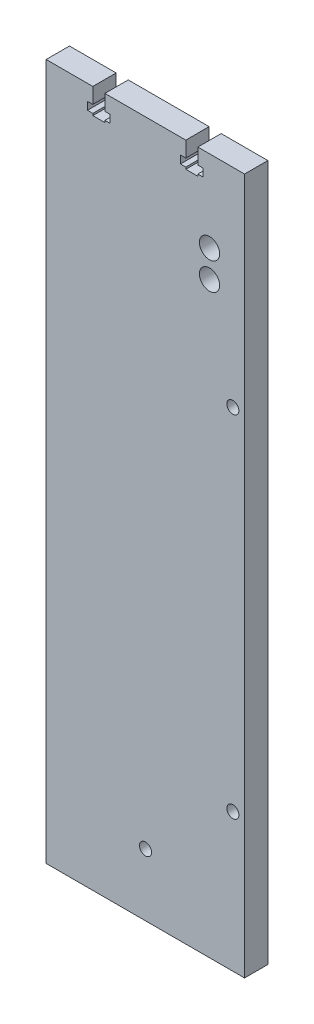
ISO-10303-21;
HEADER;
FILE_DESCRIPTION(('STEP AP214'),'2;1');
FILE_NAME('part.step','',(''),(''),'','','');
FILE_SCHEMA(('AUTOMOTIVE_DESIGN { 1 0 10303 214 1 1 1 1 }'));
ENDSEC;
DATA;
#1=APPLICATION_CONTEXT('core data for automotive mechanical design processes');
#2=APPLICATION_PROTOCOL_DEFINITION('international standard','automotive_design',2000,#1);
#3=PRODUCT_CONTEXT('',#1,'mechanical');
#4=PRODUCT('Part','Part','',(#3));
#5=PRODUCT_RELATED_PRODUCT_CATEGORY('part','',(#4));
#6=PRODUCT_DEFINITION_FORMATION('','',#4);
#7=PRODUCT_DEFINITION_CONTEXT('part definition',#1,'design');
#8=PRODUCT_DEFINITION('design','',#6,#7);
#9=PRODUCT_DEFINITION_SHAPE('','',#8);
#10=(LENGTH_UNIT() NAMED_UNIT(*) SI_UNIT(.MILLI.,.METRE.));
#11=(NAMED_UNIT(*) PLANE_ANGLE_UNIT() SI_UNIT($,.RADIAN.));
#12=(NAMED_UNIT(*) SI_UNIT($,.STERADIAN.) SOLID_ANGLE_UNIT());
#13=UNCERTAINTY_MEASURE_WITH_UNIT(LENGTH_MEASURE(1.E-05),#10,'distance_accuracy_value','');
#14=(GEOMETRIC_REPRESENTATION_CONTEXT(3) GLOBAL_UNCERTAINTY_ASSIGNED_CONTEXT((#13)) GLOBAL_UNIT_ASSIGNED_CONTEXT((#10,
#11,#12)) REPRESENTATION_CONTEXT('',''));
#15=CARTESIAN_POINT('',(0.,0.,0.));
#16=DIRECTION('',(0.,0.,1.));
#17=DIRECTION('',(1.,0.,0.));
#18=AXIS2_PLACEMENT_3D('',#15,#16,#17);
#19=CARTESIAN_POINT('',(23.5056995135494,-21.,-6.));
#20=DIRECTION('',(0.,1.,0.));
#21=DIRECTION('',(0.,0.,1.));
#22=AXIS2_PLACEMENT_3D('',#19,#20,#21);
#23=PLANE('',#22);
#24=DIRECTION('',(0.,0.,-1.));
#25=VECTOR('',#24,1.);
#26=CARTESIAN_POINT('',(35.5056995135494,-21.,0.));
#27=LINE('',#26,#25);
#28=CARTESIAN_POINT('',(35.5056995135494,-21.,0.));
#29=VERTEX_POINT('',#28);
#30=CARTESIAN_POINT('',(35.5056995135494,-21.,-6.));
#31=VERTEX_POINT('',#30);
#32=EDGE_CURVE('E221',#29,#31,#27,.T.);
#33=ORIENTED_EDGE('',*,*,#32,.T.);
#34=DIRECTION('',(-1.,0.,0.));
#35=VECTOR('',#34,1.);
#36=CARTESIAN_POINT('',(23.5056995135494,-21.,-6.));
#37=LINE('',#36,#35);
#38=CARTESIAN_POINT('',(23.5056995135494,-21.,-6.));
#39=VERTEX_POINT('',#38);
#40=EDGE_CURVE('E271',#31,#39,#37,.T.);
#41=ORIENTED_EDGE('',*,*,#40,.T.);
#42=DIRECTION('',(0.,0.,1.));
#43=VECTOR('',#42,1.);
#44=CARTESIAN_POINT('',(23.5056995135494,-21.,-6.));
#45=LINE('',#44,#43);
#46=CARTESIAN_POINT('',(23.5056995135494,-21.,0.));
#47=VERTEX_POINT('',#46);
#48=EDGE_CURVE('E11',#39,#47,#45,.T.);
#49=ORIENTED_EDGE('',*,*,#48,.T.);
#50=DIRECTION('',(-1.,0.,0.));
#51=VECTOR('',#50,1.);
#52=CARTESIAN_POINT('',(23.5056995135494,-21.,0.));
#53=LINE('',#52,#51);
#54=EDGE_CURVE('E237',#29,#47,#53,.T.);
#55=ORIENTED_EDGE('',*,*,#54,.F.);
#56=EDGE_LOOP('',(#33,#41,#49,#55));
#57=FACE_BOUND('',#56,.T.);
#58=ADVANCED_FACE('F34',(#57),#23,.T.);
#59=DIRECTION('',(0.,0.,-1.));
#60=VECTOR('',#59,1.);
#61=CARTESIAN_POINT('',(38.6056995135494,-21.,0.));
#62=LINE('',#61,#60);
#63=CARTESIAN_POINT('',(38.6056995135494,-21.,0.));
#64=VERTEX_POINT('',#63);
#65=CARTESIAN_POINT('',(38.6056995135494,-21.,-6.));
#66=VERTEX_POINT('',#65);
#67=EDGE_CURVE('E231',#64,#66,#62,.T.);
#68=ORIENTED_EDGE('',*,*,#67,.F.);
#69=CARTESIAN_POINT('',(59.4056995135494,-21.,0.));
#70=VERTEX_POINT('',#69);
#71=EDGE_CURVE('E245',#70,#64,#53,.T.);
#72=ORIENTED_EDGE('',*,*,#71,.F.);
#73=DIRECTION('',(0.,0.,-1.));
#74=VECTOR('',#73,1.);
#75=CARTESIAN_POINT('',(59.4056995135494,-21.,0.));
#76=LINE('',#75,#74);
#77=CARTESIAN_POINT('',(59.4056995135494,-21.,-6.));
#78=VERTEX_POINT('',#77);
#79=EDGE_CURVE('E299',#70,#78,#76,.T.);
#80=ORIENTED_EDGE('',*,*,#79,.T.);
#81=EDGE_CURVE('E275',#78,#66,#37,.T.);
#82=ORIENTED_EDGE('',*,*,#81,.T.);
#83=EDGE_LOOP('',(#68,#72,#80,#82));
#84=FACE_BOUND('',#83,.T.);
#85=ADVANCED_FACE('F336',(#84),#23,.T.);
#86=CARTESIAN_POINT('',(23.5056995135494,-200.,-6.));
#87=DIRECTION('',(-1.,0.,0.));
#88=DIRECTION('',(0.,-1.,0.));
#89=AXIS2_PLACEMENT_3D('',#86,#87,#88);
#90=PLANE('',#89);
#91=DIRECTION('',(0.,-1.,0.));
#92=VECTOR('',#91,1.);
#93=CARTESIAN_POINT('',(23.5056995135494,-200.,0.));
#94=LINE('',#93,#92);
#95=CARTESIAN_POINT('',(23.5056995135494,-200.,0.));
#96=VERTEX_POINT('',#95);
#97=EDGE_CURVE('E276',#47,#96,#94,.T.);
#98=ORIENTED_EDGE('',*,*,#97,.F.);
#99=ORIENTED_EDGE('',*,*,#48,.F.);
#100=DIRECTION('',(0.,-1.,0.));
#101=VECTOR('',#100,1.);
#102=CARTESIAN_POINT('',(23.5056995135494,-200.,-6.));
#103=LINE('',#102,#101);
#104=CARTESIAN_POINT('',(23.5056995135494,-200.,-6.));
#105=VERTEX_POINT('',#104);
#106=EDGE_CURVE('E254',#39,#105,#103,.T.);
#107=ORIENTED_EDGE('',*,*,#106,.T.);
#108=DIRECTION('',(0.,0.,1.));
#109=VECTOR('',#108,1.);
#110=CARTESIAN_POINT('',(23.5056995135494,-200.,-6.));
#111=LINE('',#110,#109);
#112=EDGE_CURVE('E38',#105,#96,#111,.T.);
#113=ORIENTED_EDGE('',*,*,#112,.T.);
#114=EDGE_LOOP('',(#98,#99,#107,#113));
#115=FACE_BOUND('',#114,.T.);
#116=ADVANCED_FACE('F36',(#115),#90,.T.);
#117=DIRECTION('',(0.,0.,-1.));
#118=VECTOR('',#117,1.);
#119=CARTESIAN_POINT('',(62.5056995135494,-21.,0.));
#120=LINE('',#119,#118);
#121=CARTESIAN_POINT('',(62.5056995135494,-21.,0.));
#122=VERTEX_POINT('',#121);
#123=CARTESIAN_POINT('',(62.5056995135494,-21.,-6.));
#124=VERTEX_POINT('',#123);
#125=EDGE_CURVE('E294',#122,#124,#120,.T.);
#126=ORIENTED_EDGE('',*,*,#125,.F.);
#127=CARTESIAN_POINT('',(74.5056995135493,-21.,0.));
#128=VERTEX_POINT('',#127);
#129=EDGE_CURVE('E248',#128,#122,#53,.T.);
#130=ORIENTED_EDGE('',*,*,#129,.F.);
#131=DIRECTION('',(0.,0.,1.));
#132=VECTOR('',#131,1.);
#133=CARTESIAN_POINT('',(74.5056995135493,-21.,-6.));
#134=LINE('',#133,#132);
#135=CARTESIAN_POINT('',(74.5056995135493,-21.,-6.));
#136=VERTEX_POINT('',#135);
#137=EDGE_CURVE('E43',#136,#128,#134,.T.);
#138=ORIENTED_EDGE('',*,*,#137,.F.);
#139=EDGE_CURVE('E272',#136,#124,#37,.T.);
#140=ORIENTED_EDGE('',*,*,#139,.T.);
#141=EDGE_LOOP('',(#126,#130,#138,#140));
#142=FACE_BOUND('',#141,.T.);
#143=ADVANCED_FACE('F293',(#142),#23,.T.);
#144=CARTESIAN_POINT('',(74.5056995135494,-200.,-6.));
#145=DIRECTION('',(1.,0.,0.));
#146=DIRECTION('',(0.,1.,0.));
#147=AXIS2_PLACEMENT_3D('',#144,#145,#146);
#148=PLANE('',#147);
#149=DIRECTION('',(0.,1.,0.));
#150=VECTOR('',#149,1.);
#151=CARTESIAN_POINT('',(74.5056995135494,-200.,0.));
#152=LINE('',#151,#150);
#153=CARTESIAN_POINT('',(74.5056995135494,-200.,0.));
#154=VERTEX_POINT('',#153);
#155=EDGE_CURVE('E246',#154,#128,#152,.T.);
#156=ORIENTED_EDGE('',*,*,#155,.F.);
#157=DIRECTION('',(0.,0.,1.));
#158=VECTOR('',#157,1.);
#159=CARTESIAN_POINT('',(74.5056995135494,-200.,-6.));
#160=LINE('',#159,#158);
#161=CARTESIAN_POINT('',(74.5056995135494,-200.,-6.));
#162=VERTEX_POINT('',#161);
#163=EDGE_CURVE('E285',#162,#154,#160,.T.);
#164=ORIENTED_EDGE('',*,*,#163,.F.);
#165=DIRECTION('',(0.,1.,0.));
#166=VECTOR('',#165,1.);
#167=CARTESIAN_POINT('',(74.5056995135494,-200.,-6.));
#168=LINE('',#167,#166);
#169=EDGE_CURVE('E263',#162,#136,#168,.T.);
#170=ORIENTED_EDGE('',*,*,#169,.T.);
#171=ORIENTED_EDGE('',*,*,#137,.T.);
#172=EDGE_LOOP('',(#156,#164,#170,#171));
#173=FACE_BOUND('',#172,.T.);
#174=ADVANCED_FACE('F288',(#173),#148,.T.);
#175=CARTESIAN_POINT('',(23.5056995135494,-200.,-6.));
#176=DIRECTION('',(0.,-1.,0.));
#177=DIRECTION('',(0.,0.,-1.));
#178=AXIS2_PLACEMENT_3D('',#175,#176,#177);
#179=PLANE('',#178);
#180=DIRECTION('',(1.,0.,0.));
#181=VECTOR('',#180,1.);
#182=CARTESIAN_POINT('',(23.5056995135494,-200.,0.));
#183=LINE('',#182,#181);
#184=EDGE_CURVE('E251',#96,#154,#183,.T.);
#185=ORIENTED_EDGE('',*,*,#184,.F.);
#186=ORIENTED_EDGE('',*,*,#112,.F.);
#187=DIRECTION('',(1.,0.,0.));
#188=VECTOR('',#187,1.);
#189=CARTESIAN_POINT('',(23.5056995135494,-200.,-6.));
#190=LINE('',#189,#188);
#191=EDGE_CURVE('E258',#105,#162,#190,.T.);
#192=ORIENTED_EDGE('',*,*,#191,.T.);
#193=ORIENTED_EDGE('',*,*,#163,.T.);
#194=EDGE_LOOP('',(#185,#186,#192,#193));
#195=FACE_BOUND('',#194,.T.);
#196=ADVANCED_FACE('F283',(#195),#179,.T.);
#197=CARTESIAN_POINT('',(0.,0.,-6.));
#198=DIRECTION('',(0.,0.,-1.));
#199=DIRECTION('',(-1.,0.,0.));
#200=AXIS2_PLACEMENT_3D('',#197,#198,#199);
#201=PLANE('',#200);
#202=CARTESIAN_POINT('',(49.0556995135438,-184.,-6.));
#203=DIRECTION('',(0.,0.,-1.));
#204=DIRECTION('',(-1.,0.,0.));
#205=AXIS2_PLACEMENT_3D('',#202,#203,#204);
#206=CIRCLE('',#205,1.55);
#207=CARTESIAN_POINT('',(47.5056995135438,-184.,-6.));
#208=VERTEX_POINT('',#207);
#209=EDGE_CURVE('E539',#208,#208,#206,.T.);
#210=ORIENTED_EDGE('',*,*,#209,.F.);
#211=EDGE_LOOP('',(#210));
#212=FACE_BOUND('',#211,.T.);
#213=CARTESIAN_POINT('',(65.5056995135494,-49.,-6.));
#214=DIRECTION('',(0.,0.,-1.));
#215=DIRECTION('',(-1.,0.,0.));
#216=AXIS2_PLACEMENT_3D('',#213,#214,#215);
#217=CIRCLE('',#216,2.6);
#218=CARTESIAN_POINT('',(62.9056995135494,-49.,-6.));
#219=VERTEX_POINT('',#218);
#220=EDGE_CURVE('E533',#219,#219,#217,.T.);
#221=ORIENTED_EDGE('',*,*,#220,.F.);
#222=EDGE_LOOP('',(#221));
#223=FACE_BOUND('',#222,.T.);
#224=CARTESIAN_POINT('',(65.5056995135494,-42.,-6.));
#225=DIRECTION('',(0.,0.,-1.));
#226=DIRECTION('',(-1.,0.,0.));
#227=AXIS2_PLACEMENT_3D('',#224,#225,#226);
#228=CIRCLE('',#227,2.6);
#229=CARTESIAN_POINT('',(62.9056995135494,-42.,-6.));
#230=VERTEX_POINT('',#229);
#231=EDGE_CURVE('E527',#230,#230,#228,.T.);
#232=ORIENTED_EDGE('',*,*,#231,.F.);
#233=EDGE_LOOP('',(#232));
#234=FACE_BOUND('',#233,.T.);
#235=DIRECTION('',(0.,1.,0.));
#236=VECTOR('',#235,1.);
#237=CARTESIAN_POINT('',(35.5056995135494,-21.,-6.));
#238=LINE('',#237,#236);
#239=CARTESIAN_POINT('',(35.5056995135494,-25.,-6.));
#240=VERTEX_POINT('',#239);
#241=EDGE_CURVE('E227',#240,#31,#238,.T.);
#242=ORIENTED_EDGE('',*,*,#241,.F.);
#243=DIRECTION('',(1.,0.,0.));
#244=VECTOR('',#243,1.);
#245=CARTESIAN_POINT('',(34.1306995135494,-25.,-6.));
#246=LINE('',#245,#244);
#247=CARTESIAN_POINT('',(34.1306995135494,-25.,-6.));
#248=VERTEX_POINT('',#247);
#249=EDGE_CURVE('E241',#248,#240,#246,.T.);
#250=ORIENTED_EDGE('',*,*,#249,.F.);
#251=DIRECTION('',(0.,1.,0.));
#252=VECTOR('',#251,1.);
#253=CARTESIAN_POINT('',(34.1306995135494,-27.,-6.));
#254=LINE('',#253,#252);
#255=CARTESIAN_POINT('',(34.1306995135494,-27.,-6.));
#256=VERTEX_POINT('',#255);
#257=EDGE_CURVE('E474',#256,#248,#254,.T.);
#258=ORIENTED_EDGE('',*,*,#257,.F.);
#259=DIRECTION('',(-1.,0.,0.));
#260=VECTOR('',#259,1.);
#261=CARTESIAN_POINT('',(34.1306995135494,-27.,-6.));
#262=LINE('',#261,#260);
#263=CARTESIAN_POINT('',(35.5056995135494,-27.,-6.));
#264=VERTEX_POINT('',#263);
#265=EDGE_CURVE('E477',#264,#256,#262,.T.);
#266=ORIENTED_EDGE('',*,*,#265,.F.);
#267=DIRECTION('',(0.,1.,0.));
#268=VECTOR('',#267,1.);
#269=CARTESIAN_POINT('',(35.5056995135494,-27.,-6.));
#270=LINE('',#269,#268);
#271=CARTESIAN_POINT('',(35.5056995135494,-27.5,-6.));
#272=VERTEX_POINT('',#271);
#273=EDGE_CURVE('E480',#272,#264,#270,.T.);
#274=ORIENTED_EDGE('',*,*,#273,.F.);
#275=DIRECTION('',(-1.,0.,0.));
#276=VECTOR('',#275,1.);
#277=CARTESIAN_POINT('',(35.5056995135494,-27.5,-6.));
#278=LINE('',#277,#276);
#279=CARTESIAN_POINT('',(38.6056995135494,-27.5,-6.));
#280=VERTEX_POINT('',#279);
#281=EDGE_CURVE('E483',#280,#272,#278,.T.);
#282=ORIENTED_EDGE('',*,*,#281,.F.);
#283=DIRECTION('',(0.,-1.,0.));
#284=VECTOR('',#283,1.);
#285=CARTESIAN_POINT('',(38.6056995135494,-27.,-6.));
#286=LINE('',#285,#284);
#287=CARTESIAN_POINT('',(38.6056995135494,-27.,-6.));
#288=VERTEX_POINT('',#287);
#289=EDGE_CURVE('E486',#288,#280,#286,.T.);
#290=ORIENTED_EDGE('',*,*,#289,.F.);
#291=DIRECTION('',(-1.,0.,0.));
#292=VECTOR('',#291,1.);
#293=CARTESIAN_POINT('',(38.6056995135494,-27.,-6.));
#294=LINE('',#293,#292);
#295=CARTESIAN_POINT('',(39.9806995135494,-27.,-6.));
#296=VERTEX_POINT('',#295);
#297=EDGE_CURVE('E489',#296,#288,#294,.T.);
#298=ORIENTED_EDGE('',*,*,#297,.F.);
#299=DIRECTION('',(0.,-1.,0.));
#300=VECTOR('',#299,1.);
#301=CARTESIAN_POINT('',(39.9806995135494,-27.,-6.));
#302=LINE('',#301,#300);
#303=CARTESIAN_POINT('',(39.9806995135494,-25.,-6.));
#304=VERTEX_POINT('',#303);
#305=EDGE_CURVE('E492',#304,#296,#302,.T.);
#306=ORIENTED_EDGE('',*,*,#305,.F.);
#307=DIRECTION('',(1.,0.,0.));
#308=VECTOR('',#307,1.);
#309=CARTESIAN_POINT('',(38.6056995135494,-25.,-6.));
#310=LINE('',#309,#308);
#311=CARTESIAN_POINT('',(38.6056995135494,-25.,-6.));
#312=VERTEX_POINT('',#311);
#313=EDGE_CURVE('E495',#312,#304,#310,.T.);
#314=ORIENTED_EDGE('',*,*,#313,.F.);
#315=DIRECTION('',(0.,-1.,0.));
#316=VECTOR('',#315,1.);
#317=CARTESIAN_POINT('',(38.6056995135494,-21.,-6.));
#318=LINE('',#317,#316);
#319=EDGE_CURVE('E498',#66,#312,#318,.T.);
#320=ORIENTED_EDGE('',*,*,#319,.F.);
#321=ORIENTED_EDGE('',*,*,#81,.F.);
#322=DIRECTION('',(0.,1.,0.));
#323=VECTOR('',#322,1.);
#324=CARTESIAN_POINT('',(59.4056995135494,-21.,-6.));
#325=LINE('',#324,#323);
#326=CARTESIAN_POINT('',(59.4056995135494,-25.,-6.));
#327=VERTEX_POINT('',#326);
#328=EDGE_CURVE('E357',#327,#78,#325,.T.);
#329=ORIENTED_EDGE('',*,*,#328,.F.);
#330=DIRECTION('',(1.,0.,0.));
#331=VECTOR('',#330,1.);
#332=CARTESIAN_POINT('',(58.0306995135494,-25.,-6.));
#333=LINE('',#332,#331);
#334=CARTESIAN_POINT('',(58.0306995135494,-25.,-6.));
#335=VERTEX_POINT('',#334);
#336=EDGE_CURVE('E385',#335,#327,#333,.T.);
#337=ORIENTED_EDGE('',*,*,#336,.F.);
#338=DIRECTION('',(0.,1.,0.));
#339=VECTOR('',#338,1.);
#340=CARTESIAN_POINT('',(58.0306995135494,-27.,-6.));
#341=LINE('',#340,#339);
#342=CARTESIAN_POINT('',(58.0306995135494,-27.,-6.));
#343=VERTEX_POINT('',#342);
#344=EDGE_CURVE('E382',#343,#335,#341,.T.);
#345=ORIENTED_EDGE('',*,*,#344,.F.);
#346=DIRECTION('',(-1.,0.,0.));
#347=VECTOR('',#346,1.);
#348=CARTESIAN_POINT('',(58.0306995135494,-27.,-6.));
#349=LINE('',#348,#347);
#350=CARTESIAN_POINT('',(59.4056995135494,-27.,-6.));
#351=VERTEX_POINT('',#350);
#352=EDGE_CURVE('E379',#351,#343,#349,.T.);
#353=ORIENTED_EDGE('',*,*,#352,.F.);
#354=DIRECTION('',(0.,1.,0.));
#355=VECTOR('',#354,1.);
#356=CARTESIAN_POINT('',(59.4056995135494,-27.,-6.));
#357=LINE('',#356,#355);
#358=CARTESIAN_POINT('',(59.4056995135494,-27.5,-6.));
#359=VERTEX_POINT('',#358);
#360=EDGE_CURVE('E376',#359,#351,#357,.T.);
#361=ORIENTED_EDGE('',*,*,#360,.F.);
#362=DIRECTION('',(-1.,0.,0.));
#363=VECTOR('',#362,1.);
#364=CARTESIAN_POINT('',(59.4056995135494,-27.5,-6.));
#365=LINE('',#364,#363);
#366=CARTESIAN_POINT('',(62.5056995135494,-27.5,-6.));
#367=VERTEX_POINT('',#366);
#368=EDGE_CURVE('E373',#367,#359,#365,.T.);
#369=ORIENTED_EDGE('',*,*,#368,.F.);
#370=DIRECTION('',(0.,-1.,0.));
#371=VECTOR('',#370,1.);
#372=CARTESIAN_POINT('',(62.5056995135494,-27.,-6.));
#373=LINE('',#372,#371);
#374=CARTESIAN_POINT('',(62.5056995135494,-27.,-6.));
#375=VERTEX_POINT('',#374);
#376=EDGE_CURVE('E370',#375,#367,#373,.T.);
#377=ORIENTED_EDGE('',*,*,#376,.F.);
#378=DIRECTION('',(-1.,0.,0.));
#379=VECTOR('',#378,1.);
#380=CARTESIAN_POINT('',(62.5056995135494,-27.,-6.));
#381=LINE('',#380,#379);
#382=CARTESIAN_POINT('',(63.8806995135494,-27.,-6.));
#383=VERTEX_POINT('',#382);
#384=EDGE_CURVE('E367',#383,#375,#381,.T.);
#385=ORIENTED_EDGE('',*,*,#384,.F.);
#386=DIRECTION('',(0.,-1.,0.));
#387=VECTOR('',#386,1.);
#388=CARTESIAN_POINT('',(63.8806995135494,-27.,-6.));
#389=LINE('',#388,#387);
#390=CARTESIAN_POINT('',(63.8806995135494,-25.,-6.));
#391=VERTEX_POINT('',#390);
#392=EDGE_CURVE('E359',#391,#383,#389,.T.);
#393=ORIENTED_EDGE('',*,*,#392,.F.);
#394=DIRECTION('',(1.,0.,0.));
#395=VECTOR('',#394,1.);
#396=CARTESIAN_POINT('',(62.5056995135494,-25.,-6.));
#397=LINE('',#396,#395);
#398=CARTESIAN_POINT('',(62.5056995135494,-25.,-6.));
#399=VERTEX_POINT('',#398);
#400=EDGE_CURVE('E356',#399,#391,#397,.T.);
#401=ORIENTED_EDGE('',*,*,#400,.F.);
#402=DIRECTION('',(0.,-1.,0.));
#403=VECTOR('',#402,1.);
#404=CARTESIAN_POINT('',(62.5056995135494,-21.,-6.));
#405=LINE('',#404,#403);
#406=EDGE_CURVE('E353',#124,#399,#405,.T.);
#407=ORIENTED_EDGE('',*,*,#406,.F.);
#408=ORIENTED_EDGE('',*,*,#139,.F.);
#409=ORIENTED_EDGE('',*,*,#169,.F.);
#410=ORIENTED_EDGE('',*,*,#191,.F.);
#411=ORIENTED_EDGE('',*,*,#106,.F.);
#412=ORIENTED_EDGE('',*,*,#40,.F.);
#413=EDGE_LOOP('',(#242,#250,#258,#266,#274,#282,#290,#298,#306,#314,#320,#321,#329,#337,#345,
#353,#361,#369,#377,#385,#393,#401,#407,#408,#409,#410,#411,#412));
#414=FACE_BOUND('',#413,.T.);
#415=CARTESIAN_POINT('',(71.5056995135493,-74.45,-6.));
#416=DIRECTION('',(0.,0.,-1.));
#417=DIRECTION('',(-1.,0.,0.));
#418=AXIS2_PLACEMENT_3D('',#415,#416,#417);
#419=CIRCLE('',#418,1.54999999999994);
#420=CARTESIAN_POINT('',(69.9556995135493,-74.45,-6.));
#421=VERTEX_POINT('',#420);
#422=EDGE_CURVE('E311',#421,#421,#419,.T.);
#423=ORIENTED_EDGE('',*,*,#422,.F.);
#424=EDGE_LOOP('',(#423));
#425=FACE_BOUND('',#424,.T.);
#426=CARTESIAN_POINT('',(71.5056995135493,-164.45,-6.));
#427=DIRECTION('',(0.,0.,-1.));
#428=DIRECTION('',(-1.,0.,0.));
#429=AXIS2_PLACEMENT_3D('',#426,#427,#428);
#430=CIRCLE('',#429,1.54999999999991);
#431=CARTESIAN_POINT('',(69.9556995135494,-164.45,-6.));
#432=VERTEX_POINT('',#431);
#433=EDGE_CURVE('E266',#432,#432,#430,.T.);
#434=ORIENTED_EDGE('',*,*,#433,.F.);
#435=EDGE_LOOP('',(#434));
#436=FACE_BOUND('',#435,.T.);
#437=ADVANCED_FACE('F322',(#212,#223,#234,#414,#425,#436),#201,.T.);
#438=CARTESIAN_POINT('',(0.,0.,0.));
#439=DIRECTION('',(0.,0.,-1.));
#440=DIRECTION('',(-1.,0.,0.));
#441=AXIS2_PLACEMENT_3D('',#438,#439,#440);
#442=PLANE('',#441);
#443=CARTESIAN_POINT('',(49.0556995135438,-184.,0.));
#444=DIRECTION('',(0.,0.,-1.));
#445=DIRECTION('',(-1.,0.,0.));
#446=AXIS2_PLACEMENT_3D('',#443,#444,#445);
#447=CIRCLE('',#446,1.55);
#448=CARTESIAN_POINT('',(47.5056995135438,-184.,0.));
#449=VERTEX_POINT('',#448);
#450=EDGE_CURVE('E536',#449,#449,#447,.T.);
#451=ORIENTED_EDGE('',*,*,#450,.T.);
#452=EDGE_LOOP('',(#451));
#453=FACE_BOUND('',#452,.T.);
#454=CARTESIAN_POINT('',(65.5056995135494,-49.,0.));
#455=DIRECTION('',(0.,0.,-1.));
#456=DIRECTION('',(-1.,0.,0.));
#457=AXIS2_PLACEMENT_3D('',#454,#455,#456);
#458=CIRCLE('',#457,2.6);
#459=CARTESIAN_POINT('',(62.9056995135494,-49.,0.));
#460=VERTEX_POINT('',#459);
#461=EDGE_CURVE('E530',#460,#460,#458,.T.);
#462=ORIENTED_EDGE('',*,*,#461,.T.);
#463=EDGE_LOOP('',(#462));
#464=FACE_BOUND('',#463,.T.);
#465=CARTESIAN_POINT('',(65.5056995135494,-42.,0.));
#466=DIRECTION('',(0.,0.,-1.));
#467=DIRECTION('',(-1.,0.,0.));
#468=AXIS2_PLACEMENT_3D('',#465,#466,#467);
#469=CIRCLE('',#468,2.6);
#470=CARTESIAN_POINT('',(62.9056995135494,-42.,0.));
#471=VERTEX_POINT('',#470);
#472=EDGE_CURVE('E502',#471,#471,#469,.T.);
#473=ORIENTED_EDGE('',*,*,#472,.T.);
#474=EDGE_LOOP('',(#473));
#475=FACE_BOUND('',#474,.T.);
#476=CARTESIAN_POINT('',(71.5056995135493,-74.45,0.));
#477=DIRECTION('',(0.,0.,-1.));
#478=DIRECTION('',(-1.,0.,0.));
#479=AXIS2_PLACEMENT_3D('',#476,#477,#478);
#480=CIRCLE('',#479,1.54999999999994);
#481=CARTESIAN_POINT('',(69.9556995135493,-74.45,0.));
#482=VERTEX_POINT('',#481);
#483=EDGE_CURVE('E308',#482,#482,#480,.T.);
#484=ORIENTED_EDGE('',*,*,#483,.T.);
#485=EDGE_LOOP('',(#484));
#486=FACE_BOUND('',#485,.T.);
#487=CARTESIAN_POINT('',(71.5056995135493,-164.45,0.));
#488=DIRECTION('',(0.,0.,-1.));
#489=DIRECTION('',(-1.,0.,0.));
#490=AXIS2_PLACEMENT_3D('',#487,#488,#489);
#491=CIRCLE('',#490,1.54999999999991);
#492=CARTESIAN_POINT('',(69.9556995135494,-164.45,0.));
#493=VERTEX_POINT('',#492);
#494=EDGE_CURVE('E278',#493,#493,#491,.T.);
#495=ORIENTED_EDGE('',*,*,#494,.T.);
#496=EDGE_LOOP('',(#495));
#497=FACE_BOUND('',#496,.T.);
#498=DIRECTION('',(1.,0.,0.));
#499=VECTOR('',#498,1.);
#500=CARTESIAN_POINT('',(34.1306995135494,-25.,0.));
#501=LINE('',#500,#499);
#502=CARTESIAN_POINT('',(34.1306995135494,-25.,0.));
#503=VERTEX_POINT('',#502);
#504=CARTESIAN_POINT('',(35.5056995135494,-25.,0.));
#505=VERTEX_POINT('',#504);
#506=EDGE_CURVE('E232',#503,#505,#501,.T.);
#507=ORIENTED_EDGE('',*,*,#506,.T.);
#508=DIRECTION('',(0.,1.,0.));
#509=VECTOR('',#508,1.);
#510=CARTESIAN_POINT('',(35.5056995135494,-21.,0.));
#511=LINE('',#510,#509);
#512=EDGE_CURVE('E224',#505,#29,#511,.T.);
#513=ORIENTED_EDGE('',*,*,#512,.T.);
#514=ORIENTED_EDGE('',*,*,#54,.T.);
#515=ORIENTED_EDGE('',*,*,#97,.T.);
#516=ORIENTED_EDGE('',*,*,#184,.T.);
#517=ORIENTED_EDGE('',*,*,#155,.T.);
#518=ORIENTED_EDGE('',*,*,#129,.T.);
#519=DIRECTION('',(0.,-1.,0.));
#520=VECTOR('',#519,1.);
#521=CARTESIAN_POINT('',(62.5056995135494,-21.,0.));
#522=LINE('',#521,#520);
#523=CARTESIAN_POINT('',(62.5056995135494,-25.,0.));
#524=VERTEX_POINT('',#523);
#525=EDGE_CURVE('E422',#122,#524,#522,.T.);
#526=ORIENTED_EDGE('',*,*,#525,.T.);
#527=DIRECTION('',(1.,0.,0.));
#528=VECTOR('',#527,1.);
#529=CARTESIAN_POINT('',(62.5056995135494,-25.,0.));
#530=LINE('',#529,#528);
#531=CARTESIAN_POINT('',(63.8806995135494,-25.,0.));
#532=VERTEX_POINT('',#531);
#533=EDGE_CURVE('E59',#524,#532,#530,.T.);
#534=ORIENTED_EDGE('',*,*,#533,.T.);
#535=DIRECTION('',(0.,-1.,0.));
#536=VECTOR('',#535,1.);
#537=CARTESIAN_POINT('',(63.8806995135494,-27.,0.));
#538=LINE('',#537,#536);
#539=CARTESIAN_POINT('',(63.8806995135494,-27.,0.));
#540=VERTEX_POINT('',#539);
#541=EDGE_CURVE('E408',#532,#540,#538,.T.);
#542=ORIENTED_EDGE('',*,*,#541,.T.);
#543=DIRECTION('',(-1.,0.,0.));
#544=VECTOR('',#543,1.);
#545=CARTESIAN_POINT('',(62.5056995135494,-27.,0.));
#546=LINE('',#545,#544);
#547=CARTESIAN_POINT('',(62.5056995135494,-27.,0.));
#548=VERTEX_POINT('',#547);
#549=EDGE_CURVE('E417',#540,#548,#546,.T.);
#550=ORIENTED_EDGE('',*,*,#549,.T.);
#551=DIRECTION('',(0.,-1.,0.));
#552=VECTOR('',#551,1.);
#553=CARTESIAN_POINT('',(62.5056995135494,-27.,0.));
#554=LINE('',#553,#552);
#555=CARTESIAN_POINT('',(62.5056995135494,-27.5,0.));
#556=VERTEX_POINT('',#555);
#557=EDGE_CURVE('E419',#548,#556,#554,.T.);
#558=ORIENTED_EDGE('',*,*,#557,.T.);
#559=DIRECTION('',(-1.,0.,0.));
#560=VECTOR('',#559,1.);
#561=CARTESIAN_POINT('',(59.4056995135494,-27.5,0.));
#562=LINE('',#561,#560);
#563=CARTESIAN_POINT('',(59.4056995135494,-27.5,0.));
#564=VERTEX_POINT('',#563);
#565=EDGE_CURVE('E427',#556,#564,#562,.T.);
#566=ORIENTED_EDGE('',*,*,#565,.T.);
#567=DIRECTION('',(0.,1.,0.));
#568=VECTOR('',#567,1.);
#569=CARTESIAN_POINT('',(59.4056995135494,-27.,0.));
#570=LINE('',#569,#568);
#571=CARTESIAN_POINT('',(59.4056995135494,-27.,0.));
#572=VERTEX_POINT('',#571);
#573=EDGE_CURVE('E430',#564,#572,#570,.T.);
#574=ORIENTED_EDGE('',*,*,#573,.T.);
#575=DIRECTION('',(-1.,0.,0.));
#576=VECTOR('',#575,1.);
#577=CARTESIAN_POINT('',(58.0306995135494,-27.,0.));
#578=LINE('',#577,#576);
#579=CARTESIAN_POINT('',(58.0306995135494,-27.,0.));
#580=VERTEX_POINT('',#579);
#581=EDGE_CURVE('E433',#572,#580,#578,.T.);
#582=ORIENTED_EDGE('',*,*,#581,.T.);
#583=DIRECTION('',(0.,1.,0.));
#584=VECTOR('',#583,1.);
#585=CARTESIAN_POINT('',(58.0306995135494,-27.,0.));
#586=LINE('',#585,#584);
#587=CARTESIAN_POINT('',(58.0306995135494,-25.,0.));
#588=VERTEX_POINT('',#587);
#589=EDGE_CURVE('E436',#580,#588,#586,.T.);
#590=ORIENTED_EDGE('',*,*,#589,.T.);
#591=DIRECTION('',(1.,0.,0.));
#592=VECTOR('',#591,1.);
#593=CARTESIAN_POINT('',(58.0306995135494,-25.,0.));
#594=LINE('',#593,#592);
#595=CARTESIAN_POINT('',(59.4056995135494,-25.,0.));
#596=VERTEX_POINT('',#595);
#597=EDGE_CURVE('E304',#588,#596,#594,.T.);
#598=ORIENTED_EDGE('',*,*,#597,.T.);
#599=DIRECTION('',(0.,1.,0.));
#600=VECTOR('',#599,1.);
#601=CARTESIAN_POINT('',(59.4056995135494,-21.,0.));
#602=LINE('',#601,#600);
#603=EDGE_CURVE('E388',#596,#70,#602,.T.);
#604=ORIENTED_EDGE('',*,*,#603,.T.);
#605=ORIENTED_EDGE('',*,*,#71,.T.);
#606=DIRECTION('',(0.,-1.,0.));
#607=VECTOR('',#606,1.);
#608=CARTESIAN_POINT('',(38.6056995135494,-21.,0.));
#609=LINE('',#608,#607);
#610=CARTESIAN_POINT('',(38.6056995135494,-25.,0.));
#611=VERTEX_POINT('',#610);
#612=EDGE_CURVE('E240',#64,#611,#609,.T.);
#613=ORIENTED_EDGE('',*,*,#612,.T.);
#614=DIRECTION('',(1.,0.,0.));
#615=VECTOR('',#614,1.);
#616=CARTESIAN_POINT('',(38.6056995135494,-25.,0.));
#617=LINE('',#616,#615);
#618=CARTESIAN_POINT('',(39.9806995135494,-25.,0.));
#619=VERTEX_POINT('',#618);
#620=EDGE_CURVE('E51',#611,#619,#617,.T.);
#621=ORIENTED_EDGE('',*,*,#620,.T.);
#622=DIRECTION('',(0.,-1.,0.));
#623=VECTOR('',#622,1.);
#624=CARTESIAN_POINT('',(39.9806995135494,-27.,0.));
#625=LINE('',#624,#623);
#626=CARTESIAN_POINT('',(39.9806995135494,-27.,0.));
#627=VERTEX_POINT('',#626);
#628=EDGE_CURVE('E521',#619,#627,#625,.T.);
#629=ORIENTED_EDGE('',*,*,#628,.T.);
#630=DIRECTION('',(-1.,0.,0.));
#631=VECTOR('',#630,1.);
#632=CARTESIAN_POINT('',(38.6056995135494,-27.,0.));
#633=LINE('',#632,#631);
#634=CARTESIAN_POINT('',(38.6056995135494,-27.,0.));
#635=VERTEX_POINT('',#634);
#636=EDGE_CURVE('E518',#627,#635,#633,.T.);
#637=ORIENTED_EDGE('',*,*,#636,.T.);
#638=DIRECTION('',(0.,-1.,0.));
#639=VECTOR('',#638,1.);
#640=CARTESIAN_POINT('',(38.6056995135494,-27.,0.));
#641=LINE('',#640,#639);
#642=CARTESIAN_POINT('',(38.6056995135494,-27.5,0.));
#643=VERTEX_POINT('',#642);
#644=EDGE_CURVE('E515',#635,#643,#641,.T.);
#645=ORIENTED_EDGE('',*,*,#644,.T.);
#646=DIRECTION('',(-1.,0.,0.));
#647=VECTOR('',#646,1.);
#648=CARTESIAN_POINT('',(35.5056995135494,-27.5,0.));
#649=LINE('',#648,#647);
#650=CARTESIAN_POINT('',(35.5056995135494,-27.5,0.));
#651=VERTEX_POINT('',#650);
#652=EDGE_CURVE('E512',#643,#651,#649,.T.);
#653=ORIENTED_EDGE('',*,*,#652,.T.);
#654=DIRECTION('',(0.,1.,0.));
#655=VECTOR('',#654,1.);
#656=CARTESIAN_POINT('',(35.5056995135494,-27.,0.));
#657=LINE('',#656,#655);
#658=CARTESIAN_POINT('',(35.5056995135494,-27.,0.));
#659=VERTEX_POINT('',#658);
#660=EDGE_CURVE('E509',#651,#659,#657,.T.);
#661=ORIENTED_EDGE('',*,*,#660,.T.);
#662=DIRECTION('',(-1.,0.,0.));
#663=VECTOR('',#662,1.);
#664=CARTESIAN_POINT('',(34.1306995135494,-27.,0.));
#665=LINE('',#664,#663);
#666=CARTESIAN_POINT('',(34.1306995135494,-27.,0.));
#667=VERTEX_POINT('',#666);
#668=EDGE_CURVE('E506',#659,#667,#665,.T.);
#669=ORIENTED_EDGE('',*,*,#668,.T.);
#670=DIRECTION('',(0.,1.,0.));
#671=VECTOR('',#670,1.);
#672=CARTESIAN_POINT('',(34.1306995135494,-27.,0.));
#673=LINE('',#672,#671);
#674=EDGE_CURVE('E504',#667,#503,#673,.T.);
#675=ORIENTED_EDGE('',*,*,#674,.T.);
#676=EDGE_LOOP('',(#507,#513,#514,#515,#516,#517,#518,#526,#534,#542,#550,#558,#566,#574,#582,
#590,#598,#604,#605,#613,#621,#629,#637,#645,#653,#661,#669,#675));
#677=FACE_BOUND('',#676,.T.);
#678=ADVANCED_FACE('F235',(#453,#464,#475,#486,#497,#677),#442,.F.);
#679=CARTESIAN_POINT('',(71.5056995135493,-164.45,0.));
#680=DIRECTION('',(0.,0.,-1.));
#681=DIRECTION('',(-1.,0.,0.));
#682=AXIS2_PLACEMENT_3D('',#679,#680,#681);
#683=CYLINDRICAL_SURFACE('',#682,1.54999999999991);
#684=ORIENTED_EDGE('',*,*,#494,.F.);
#685=EDGE_LOOP('',(#684));
#686=FACE_BOUND('',#685,.T.);
#687=ORIENTED_EDGE('',*,*,#433,.T.);
#688=EDGE_LOOP('',(#687));
#689=FACE_BOUND('',#688,.T.);
#690=ADVANCED_FACE('F320',(#686,#689),#683,.F.);
#691=CARTESIAN_POINT('',(71.5056995135493,-74.45,0.));
#692=DIRECTION('',(0.,0.,-1.));
#693=DIRECTION('',(-1.,0.,0.));
#694=AXIS2_PLACEMENT_3D('',#691,#692,#693);
#695=CYLINDRICAL_SURFACE('',#694,1.54999999999994);
#696=ORIENTED_EDGE('',*,*,#483,.F.);
#697=EDGE_LOOP('',(#696));
#698=FACE_BOUND('',#697,.T.);
#699=ORIENTED_EDGE('',*,*,#422,.T.);
#700=EDGE_LOOP('',(#699));
#701=FACE_BOUND('',#700,.T.);
#702=ADVANCED_FACE('F635',(#698,#701),#695,.F.);
#703=CARTESIAN_POINT('',(59.4056995135494,-21.,0.));
#704=DIRECTION('',(-1.,0.,0.));
#705=DIRECTION('',(0.,-1.,0.));
#706=AXIS2_PLACEMENT_3D('',#703,#704,#705);
#707=PLANE('',#706);
#708=ORIENTED_EDGE('',*,*,#328,.T.);
#709=ORIENTED_EDGE('',*,*,#79,.F.);
#710=ORIENTED_EDGE('',*,*,#603,.F.);
#711=DIRECTION('',(0.,0.,-1.));
#712=VECTOR('',#711,1.);
#713=CARTESIAN_POINT('',(59.4056995135494,-25.,0.));
#714=LINE('',#713,#712);
#715=EDGE_CURVE('E313',#596,#327,#714,.T.);
#716=ORIENTED_EDGE('',*,*,#715,.T.);
#717=EDGE_LOOP('',(#708,#709,#710,#716));
#718=FACE_BOUND('',#717,.T.);
#719=ADVANCED_FACE('F449',(#718),#707,.F.);
#720=CARTESIAN_POINT('',(58.0306995135494,-25.,0.));
#721=DIRECTION('',(0.,1.,0.));
#722=DIRECTION('',(0.,0.,1.));
#723=AXIS2_PLACEMENT_3D('',#720,#721,#722);
#724=PLANE('',#723);
#725=ORIENTED_EDGE('',*,*,#336,.T.);
#726=ORIENTED_EDGE('',*,*,#715,.F.);
#727=ORIENTED_EDGE('',*,*,#597,.F.);
#728=DIRECTION('',(0.,0.,-1.));
#729=VECTOR('',#728,1.);
#730=CARTESIAN_POINT('',(58.0306995135494,-25.,0.));
#731=LINE('',#730,#729);
#732=EDGE_CURVE('E390',#588,#335,#731,.T.);
#733=ORIENTED_EDGE('',*,*,#732,.T.);
#734=EDGE_LOOP('',(#725,#726,#727,#733));
#735=FACE_BOUND('',#734,.T.);
#736=ADVANCED_FACE('F445',(#735),#724,.F.);
#737=CARTESIAN_POINT('',(58.0306995135494,-27.,0.));
#738=DIRECTION('',(-1.,0.,0.));
#739=DIRECTION('',(0.,0.,1.));
#740=AXIS2_PLACEMENT_3D('',#737,#738,#739);
#741=PLANE('',#740);
#742=ORIENTED_EDGE('',*,*,#344,.T.);
#743=ORIENTED_EDGE('',*,*,#732,.F.);
#744=ORIENTED_EDGE('',*,*,#589,.F.);
#745=DIRECTION('',(0.,0.,-1.));
#746=VECTOR('',#745,1.);
#747=CARTESIAN_POINT('',(58.0306995135494,-27.,0.));
#748=LINE('',#747,#746);
#749=EDGE_CURVE('E392',#580,#343,#748,.T.);
#750=ORIENTED_EDGE('',*,*,#749,.T.);
#751=EDGE_LOOP('',(#742,#743,#744,#750));
#752=FACE_BOUND('',#751,.T.);
#753=ADVANCED_FACE('F605',(#752),#741,.F.);
#754=CARTESIAN_POINT('',(58.0306995135494,-27.,0.));
#755=DIRECTION('',(0.,-1.,0.));
#756=DIRECTION('',(0.,0.,-1.));
#757=AXIS2_PLACEMENT_3D('',#754,#755,#756);
#758=PLANE('',#757);
#759=ORIENTED_EDGE('',*,*,#352,.T.);
#760=ORIENTED_EDGE('',*,*,#749,.F.);
#761=ORIENTED_EDGE('',*,*,#581,.F.);
#762=DIRECTION('',(0.,0.,-1.));
#763=VECTOR('',#762,1.);
#764=CARTESIAN_POINT('',(59.4056995135494,-27.,0.));
#765=LINE('',#764,#763);
#766=EDGE_CURVE('E394',#572,#351,#765,.T.);
#767=ORIENTED_EDGE('',*,*,#766,.T.);
#768=EDGE_LOOP('',(#759,#760,#761,#767));
#769=FACE_BOUND('',#768,.T.);
#770=ADVANCED_FACE('F608',(#769),#758,.F.);
#771=CARTESIAN_POINT('',(59.4056995135494,-27.,0.));
#772=DIRECTION('',(-1.,0.,0.));
#773=DIRECTION('',(0.,0.,1.));
#774=AXIS2_PLACEMENT_3D('',#771,#772,#773);
#775=PLANE('',#774);
#776=ORIENTED_EDGE('',*,*,#360,.T.);
#777=ORIENTED_EDGE('',*,*,#766,.F.);
#778=ORIENTED_EDGE('',*,*,#573,.F.);
#779=DIRECTION('',(0.,0.,-1.));
#780=VECTOR('',#779,1.);
#781=CARTESIAN_POINT('',(59.4056995135494,-27.5,0.));
#782=LINE('',#781,#780);
#783=EDGE_CURVE('E396',#564,#359,#782,.T.);
#784=ORIENTED_EDGE('',*,*,#783,.T.);
#785=EDGE_LOOP('',(#776,#777,#778,#784));
#786=FACE_BOUND('',#785,.T.);
#787=ADVANCED_FACE('F612',(#786),#775,.F.);
#788=CARTESIAN_POINT('',(59.4056995135494,-27.5,0.));
#789=DIRECTION('',(0.,-1.,0.));
#790=DIRECTION('',(0.,0.,-1.));
#791=AXIS2_PLACEMENT_3D('',#788,#789,#790);
#792=PLANE('',#791);
#793=ORIENTED_EDGE('',*,*,#368,.T.);
#794=ORIENTED_EDGE('',*,*,#783,.F.);
#795=ORIENTED_EDGE('',*,*,#565,.F.);
#796=DIRECTION('',(0.,0.,-1.));
#797=VECTOR('',#796,1.);
#798=CARTESIAN_POINT('',(62.5056995135494,-27.5,0.));
#799=LINE('',#798,#797);
#800=EDGE_CURVE('E398',#556,#367,#799,.T.);
#801=ORIENTED_EDGE('',*,*,#800,.T.);
#802=EDGE_LOOP('',(#793,#794,#795,#801));
#803=FACE_BOUND('',#802,.T.);
#804=ADVANCED_FACE('F616',(#803),#792,.F.);
#805=CARTESIAN_POINT('',(62.5056995135494,-27.,0.));
#806=DIRECTION('',(1.,0.,0.));
#807=DIRECTION('',(0.,0.,-1.));
#808=AXIS2_PLACEMENT_3D('',#805,#806,#807);
#809=PLANE('',#808);
#810=ORIENTED_EDGE('',*,*,#376,.T.);
#811=ORIENTED_EDGE('',*,*,#800,.F.);
#812=ORIENTED_EDGE('',*,*,#557,.F.);
#813=DIRECTION('',(0.,0.,-1.));
#814=VECTOR('',#813,1.);
#815=CARTESIAN_POINT('',(62.5056995135494,-27.,0.));
#816=LINE('',#815,#814);
#817=EDGE_CURVE('E400',#548,#375,#816,.T.);
#818=ORIENTED_EDGE('',*,*,#817,.T.);
#819=EDGE_LOOP('',(#810,#811,#812,#818));
#820=FACE_BOUND('',#819,.T.);
#821=ADVANCED_FACE('F620',(#820),#809,.F.);
#822=CARTESIAN_POINT('',(62.5056995135494,-27.,0.));
#823=DIRECTION('',(0.,-1.,0.));
#824=DIRECTION('',(0.,0.,-1.));
#825=AXIS2_PLACEMENT_3D('',#822,#823,#824);
#826=PLANE('',#825);
#827=ORIENTED_EDGE('',*,*,#384,.T.);
#828=ORIENTED_EDGE('',*,*,#817,.F.);
#829=ORIENTED_EDGE('',*,*,#549,.F.);
#830=DIRECTION('',(0.,0.,-1.));
#831=VECTOR('',#830,1.);
#832=CARTESIAN_POINT('',(63.8806995135494,-27.,0.));
#833=LINE('',#832,#831);
#834=EDGE_CURVE('E402',#540,#383,#833,.T.);
#835=ORIENTED_EDGE('',*,*,#834,.T.);
#836=EDGE_LOOP('',(#827,#828,#829,#835));
#837=FACE_BOUND('',#836,.T.);
#838=ADVANCED_FACE('F413',(#837),#826,.F.);
#839=CARTESIAN_POINT('',(63.8806995135494,-27.,0.));
#840=DIRECTION('',(1.,0.,0.));
#841=DIRECTION('',(0.,0.,-1.));
#842=AXIS2_PLACEMENT_3D('',#839,#840,#841);
#843=PLANE('',#842);
#844=ORIENTED_EDGE('',*,*,#392,.T.);
#845=ORIENTED_EDGE('',*,*,#834,.F.);
#846=ORIENTED_EDGE('',*,*,#541,.F.);
#847=DIRECTION('',(0.,0.,-1.));
#848=VECTOR('',#847,1.);
#849=CARTESIAN_POINT('',(63.8806995135494,-25.,0.));
#850=LINE('',#849,#848);
#851=EDGE_CURVE('E301',#532,#391,#850,.T.);
#852=ORIENTED_EDGE('',*,*,#851,.T.);
#853=EDGE_LOOP('',(#844,#845,#846,#852));
#854=FACE_BOUND('',#853,.T.);
#855=ADVANCED_FACE('F405',(#854),#843,.F.);
#856=CARTESIAN_POINT('',(62.5056995135494,-25.,0.));
#857=DIRECTION('',(0.,1.,0.));
#858=DIRECTION('',(0.,0.,1.));
#859=AXIS2_PLACEMENT_3D('',#856,#857,#858);
#860=PLANE('',#859);
#861=ORIENTED_EDGE('',*,*,#400,.T.);
#862=ORIENTED_EDGE('',*,*,#851,.F.);
#863=ORIENTED_EDGE('',*,*,#533,.F.);
#864=DIRECTION('',(0.,0.,-1.));
#865=VECTOR('',#864,1.);
#866=CARTESIAN_POINT('',(62.5056995135494,-25.,0.));
#867=LINE('',#866,#865);
#868=EDGE_CURVE('E298',#524,#399,#867,.T.);
#869=ORIENTED_EDGE('',*,*,#868,.T.);
#870=EDGE_LOOP('',(#861,#862,#863,#869));
#871=FACE_BOUND('',#870,.T.);
#872=ADVANCED_FACE('F409',(#871),#860,.F.);
#873=CARTESIAN_POINT('',(62.5056995135494,-21.,0.));
#874=DIRECTION('',(1.,0.,0.));
#875=DIRECTION('',(0.,0.,-1.));
#876=AXIS2_PLACEMENT_3D('',#873,#874,#875);
#877=PLANE('',#876);
#878=ORIENTED_EDGE('',*,*,#406,.T.);
#879=ORIENTED_EDGE('',*,*,#868,.F.);
#880=ORIENTED_EDGE('',*,*,#525,.F.);
#881=ORIENTED_EDGE('',*,*,#125,.T.);
#882=EDGE_LOOP('',(#878,#879,#880,#881));
#883=FACE_BOUND('',#882,.T.);
#884=ADVANCED_FACE('F602',(#883),#877,.F.);
#885=CARTESIAN_POINT('',(35.5056995135494,-21.,0.));
#886=DIRECTION('',(-1.,0.,0.));
#887=DIRECTION('',(0.,-1.,0.));
#888=AXIS2_PLACEMENT_3D('',#885,#886,#887);
#889=PLANE('',#888);
#890=ORIENTED_EDGE('',*,*,#241,.T.);
#891=ORIENTED_EDGE('',*,*,#32,.F.);
#892=ORIENTED_EDGE('',*,*,#512,.F.);
#893=DIRECTION('',(0.,0.,-1.));
#894=VECTOR('',#893,1.);
#895=CARTESIAN_POINT('',(35.5056995135494,-25.,0.));
#896=LINE('',#895,#894);
#897=EDGE_CURVE('E361',#505,#240,#896,.T.);
#898=ORIENTED_EDGE('',*,*,#897,.T.);
#899=EDGE_LOOP('',(#890,#891,#892,#898));
#900=FACE_BOUND('',#899,.T.);
#901=ADVANCED_FACE('F223',(#900),#889,.F.);
#902=CARTESIAN_POINT('',(34.1306995135494,-25.,0.));
#903=DIRECTION('',(0.,1.,0.));
#904=DIRECTION('',(0.,0.,1.));
#905=AXIS2_PLACEMENT_3D('',#902,#903,#904);
#906=PLANE('',#905);
#907=ORIENTED_EDGE('',*,*,#249,.T.);
#908=ORIENTED_EDGE('',*,*,#897,.F.);
#909=ORIENTED_EDGE('',*,*,#506,.F.);
#910=DIRECTION('',(0.,0.,-1.));
#911=VECTOR('',#910,1.);
#912=CARTESIAN_POINT('',(34.1306995135494,-25.,0.));
#913=LINE('',#912,#911);
#914=EDGE_CURVE('E469',#503,#248,#913,.T.);
#915=ORIENTED_EDGE('',*,*,#914,.T.);
#916=EDGE_LOOP('',(#907,#908,#909,#915));
#917=FACE_BOUND('',#916,.T.);
#918=ADVANCED_FACE('F562',(#917),#906,.F.);
#919=CARTESIAN_POINT('',(34.1306995135494,-27.,0.));
#920=DIRECTION('',(-1.,0.,0.));
#921=DIRECTION('',(0.,0.,1.));
#922=AXIS2_PLACEMENT_3D('',#919,#920,#921);
#923=PLANE('',#922);
#924=ORIENTED_EDGE('',*,*,#257,.T.);
#925=ORIENTED_EDGE('',*,*,#914,.F.);
#926=ORIENTED_EDGE('',*,*,#674,.F.);
#927=DIRECTION('',(0.,0.,-1.));
#928=VECTOR('',#927,1.);
#929=CARTESIAN_POINT('',(34.1306995135494,-27.,0.));
#930=LINE('',#929,#928);
#931=EDGE_CURVE('E467',#667,#256,#930,.T.);
#932=ORIENTED_EDGE('',*,*,#931,.T.);
#933=EDGE_LOOP('',(#924,#925,#926,#932));
#934=FACE_BOUND('',#933,.T.);
#935=ADVANCED_FACE('F565',(#934),#923,.F.);
#936=CARTESIAN_POINT('',(34.1306995135494,-27.,0.));
#937=DIRECTION('',(0.,-1.,0.));
#938=DIRECTION('',(0.,0.,-1.));
#939=AXIS2_PLACEMENT_3D('',#936,#937,#938);
#940=PLANE('',#939);
#941=ORIENTED_EDGE('',*,*,#265,.T.);
#942=ORIENTED_EDGE('',*,*,#931,.F.);
#943=ORIENTED_EDGE('',*,*,#668,.F.);
#944=DIRECTION('',(0.,0.,-1.));
#945=VECTOR('',#944,1.);
#946=CARTESIAN_POINT('',(35.5056995135494,-27.,0.));
#947=LINE('',#946,#945);
#948=EDGE_CURVE('E465',#659,#264,#947,.T.);
#949=ORIENTED_EDGE('',*,*,#948,.T.);
#950=EDGE_LOOP('',(#941,#942,#943,#949));
#951=FACE_BOUND('',#950,.T.);
#952=ADVANCED_FACE('F569',(#951),#940,.F.);
#953=CARTESIAN_POINT('',(35.5056995135494,-27.,0.));
#954=DIRECTION('',(-1.,0.,0.));
#955=DIRECTION('',(0.,0.,1.));
#956=AXIS2_PLACEMENT_3D('',#953,#954,#955);
#957=PLANE('',#956);
#958=ORIENTED_EDGE('',*,*,#273,.T.);
#959=ORIENTED_EDGE('',*,*,#948,.F.);
#960=ORIENTED_EDGE('',*,*,#660,.F.);
#961=DIRECTION('',(0.,0.,-1.));
#962=VECTOR('',#961,1.);
#963=CARTESIAN_POINT('',(35.5056995135494,-27.5,0.));
#964=LINE('',#963,#962);
#965=EDGE_CURVE('E463',#651,#272,#964,.T.);
#966=ORIENTED_EDGE('',*,*,#965,.T.);
#967=EDGE_LOOP('',(#958,#959,#960,#966));
#968=FACE_BOUND('',#967,.T.);
#969=ADVANCED_FACE('F573',(#968),#957,.F.);
#970=CARTESIAN_POINT('',(35.5056995135494,-27.5,0.));
#971=DIRECTION('',(0.,-1.,0.));
#972=DIRECTION('',(0.,0.,-1.));
#973=AXIS2_PLACEMENT_3D('',#970,#971,#972);
#974=PLANE('',#973);
#975=ORIENTED_EDGE('',*,*,#281,.T.);
#976=ORIENTED_EDGE('',*,*,#965,.F.);
#977=ORIENTED_EDGE('',*,*,#652,.F.);
#978=DIRECTION('',(0.,0.,-1.));
#979=VECTOR('',#978,1.);
#980=CARTESIAN_POINT('',(38.6056995135494,-27.5,0.));
#981=LINE('',#980,#979);
#982=EDGE_CURVE('E461',#643,#280,#981,.T.);
#983=ORIENTED_EDGE('',*,*,#982,.T.);
#984=EDGE_LOOP('',(#975,#976,#977,#983));
#985=FACE_BOUND('',#984,.T.);
#986=ADVANCED_FACE('F577',(#985),#974,.F.);
#987=CARTESIAN_POINT('',(38.6056995135494,-27.,0.));
#988=DIRECTION('',(1.,0.,0.));
#989=DIRECTION('',(0.,0.,-1.));
#990=AXIS2_PLACEMENT_3D('',#987,#988,#989);
#991=PLANE('',#990);
#992=ORIENTED_EDGE('',*,*,#289,.T.);
#993=ORIENTED_EDGE('',*,*,#982,.F.);
#994=ORIENTED_EDGE('',*,*,#644,.F.);
#995=DIRECTION('',(0.,0.,-1.));
#996=VECTOR('',#995,1.);
#997=CARTESIAN_POINT('',(38.6056995135494,-27.,0.));
#998=LINE('',#997,#996);
#999=EDGE_CURVE('E459',#635,#288,#998,.T.);
#1000=ORIENTED_EDGE('',*,*,#999,.T.);
#1001=EDGE_LOOP('',(#992,#993,#994,#1000));
#1002=FACE_BOUND('',#1001,.T.);
#1003=ADVANCED_FACE('F581',(#1002),#991,.F.);
#1004=CARTESIAN_POINT('',(38.6056995135494,-27.,0.));
#1005=DIRECTION('',(0.,-1.,0.));
#1006=DIRECTION('',(0.,0.,-1.));
#1007=AXIS2_PLACEMENT_3D('',#1004,#1005,#1006);
#1008=PLANE('',#1007);
#1009=ORIENTED_EDGE('',*,*,#297,.T.);
#1010=ORIENTED_EDGE('',*,*,#999,.F.);
#1011=ORIENTED_EDGE('',*,*,#636,.F.);
#1012=DIRECTION('',(0.,0.,-1.));
#1013=VECTOR('',#1012,1.);
#1014=CARTESIAN_POINT('',(39.9806995135494,-27.,0.));
#1015=LINE('',#1014,#1013);
#1016=EDGE_CURVE('E457',#627,#296,#1015,.T.);
#1017=ORIENTED_EDGE('',*,*,#1016,.T.);
#1018=EDGE_LOOP('',(#1009,#1010,#1011,#1017));
#1019=FACE_BOUND('',#1018,.T.);
#1020=ADVANCED_FACE('F585',(#1019),#1008,.F.);
#1021=CARTESIAN_POINT('',(39.9806995135494,-27.,0.));
#1022=DIRECTION('',(1.,0.,0.));
#1023=DIRECTION('',(0.,0.,-1.));
#1024=AXIS2_PLACEMENT_3D('',#1021,#1022,#1023);
#1025=PLANE('',#1024);
#1026=ORIENTED_EDGE('',*,*,#305,.T.);
#1027=ORIENTED_EDGE('',*,*,#1016,.F.);
#1028=ORIENTED_EDGE('',*,*,#628,.F.);
#1029=DIRECTION('',(0.,0.,-1.));
#1030=VECTOR('',#1029,1.);
#1031=CARTESIAN_POINT('',(39.9806995135494,-25.,0.));
#1032=LINE('',#1031,#1030);
#1033=EDGE_CURVE('E455',#619,#304,#1032,.T.);
#1034=ORIENTED_EDGE('',*,*,#1033,.T.);
#1035=EDGE_LOOP('',(#1026,#1027,#1028,#1034));
#1036=FACE_BOUND('',#1035,.T.);
#1037=ADVANCED_FACE('F589',(#1036),#1025,.F.);
#1038=CARTESIAN_POINT('',(38.6056995135494,-25.,0.));
#1039=DIRECTION('',(0.,1.,0.));
#1040=DIRECTION('',(0.,0.,1.));
#1041=AXIS2_PLACEMENT_3D('',#1038,#1039,#1040);
#1042=PLANE('',#1041);
#1043=ORIENTED_EDGE('',*,*,#313,.T.);
#1044=ORIENTED_EDGE('',*,*,#1033,.F.);
#1045=ORIENTED_EDGE('',*,*,#620,.F.);
#1046=DIRECTION('',(0.,0.,-1.));
#1047=VECTOR('',#1046,1.);
#1048=CARTESIAN_POINT('',(38.6056995135494,-25.,0.));
#1049=LINE('',#1048,#1047);
#1050=EDGE_CURVE('E453',#611,#312,#1049,.T.);
#1051=ORIENTED_EDGE('',*,*,#1050,.T.);
#1052=EDGE_LOOP('',(#1043,#1044,#1045,#1051));
#1053=FACE_BOUND('',#1052,.T.);
#1054=ADVANCED_FACE('F593',(#1053),#1042,.F.);
#1055=CARTESIAN_POINT('',(38.6056995135494,-21.,0.));
#1056=DIRECTION('',(1.,0.,0.));
#1057=DIRECTION('',(0.,0.,-1.));
#1058=AXIS2_PLACEMENT_3D('',#1055,#1056,#1057);
#1059=PLANE('',#1058);
#1060=ORIENTED_EDGE('',*,*,#319,.T.);
#1061=ORIENTED_EDGE('',*,*,#1050,.F.);
#1062=ORIENTED_EDGE('',*,*,#612,.F.);
#1063=ORIENTED_EDGE('',*,*,#67,.T.);
#1064=EDGE_LOOP('',(#1060,#1061,#1062,#1063));
#1065=FACE_BOUND('',#1064,.T.);
#1066=ADVANCED_FACE('F560',(#1065),#1059,.F.);
#1067=CARTESIAN_POINT('',(65.5056995135494,-42.,0.));
#1068=DIRECTION('',(0.,0.,-1.));
#1069=DIRECTION('',(-1.,0.,0.));
#1070=AXIS2_PLACEMENT_3D('',#1067,#1068,#1069);
#1071=CYLINDRICAL_SURFACE('',#1070,2.6);
#1072=ORIENTED_EDGE('',*,*,#472,.F.);
#1073=EDGE_LOOP('',(#1072));
#1074=FACE_BOUND('',#1073,.T.);
#1075=ORIENTED_EDGE('',*,*,#231,.T.);
#1076=EDGE_LOOP('',(#1075));
#1077=FACE_BOUND('',#1076,.T.);
#1078=ADVANCED_FACE('F554',(#1074,#1077),#1071,.F.);
#1079=CARTESIAN_POINT('',(65.5056995135494,-49.,0.));
#1080=DIRECTION('',(0.,0.,-1.));
#1081=DIRECTION('',(-1.,0.,0.));
#1082=AXIS2_PLACEMENT_3D('',#1079,#1080,#1081);
#1083=CYLINDRICAL_SURFACE('',#1082,2.6);
#1084=ORIENTED_EDGE('',*,*,#461,.F.);
#1085=EDGE_LOOP('',(#1084));
#1086=FACE_BOUND('',#1085,.T.);
#1087=ORIENTED_EDGE('',*,*,#220,.T.);
#1088=EDGE_LOOP('',(#1087));
#1089=FACE_BOUND('',#1088,.T.);
#1090=ADVANCED_FACE('F549',(#1086,#1089),#1083,.F.);
#1091=CARTESIAN_POINT('',(49.0556995135438,-184.,0.));
#1092=DIRECTION('',(0.,0.,-1.));
#1093=DIRECTION('',(-1.,0.,0.));
#1094=AXIS2_PLACEMENT_3D('',#1091,#1092,#1093);
#1095=CYLINDRICAL_SURFACE('',#1094,1.55);
#1096=ORIENTED_EDGE('',*,*,#450,.F.);
#1097=EDGE_LOOP('',(#1096));
#1098=FACE_BOUND('',#1097,.T.);
#1099=ORIENTED_EDGE('',*,*,#209,.T.);
#1100=EDGE_LOOP('',(#1099));
#1101=FACE_BOUND('',#1100,.T.);
#1102=ADVANCED_FACE('F546',(#1098,#1101),#1095,.F.);
#1103=CLOSED_SHELL('',(#58,#85,#116,#143,#174,#196,#437,#678,#690,#702,#719,#736,#753,#770,#787,
#804,#821,#838,#855,#872,#884,#901,#918,#935,#952,#969,#986,#1003,#1020,#1037,#1054,#1066,#1078,
#1090,#1102));
#1104=MANIFOLD_SOLID_BREP('B2',#1103);
#1105=ADVANCED_BREP_SHAPE_REPRESENTATION('',(#18,#1104),#14);
#1106=SHAPE_DEFINITION_REPRESENTATION(#9,#1105);
ENDSEC;
END-ISO-10303-21;
